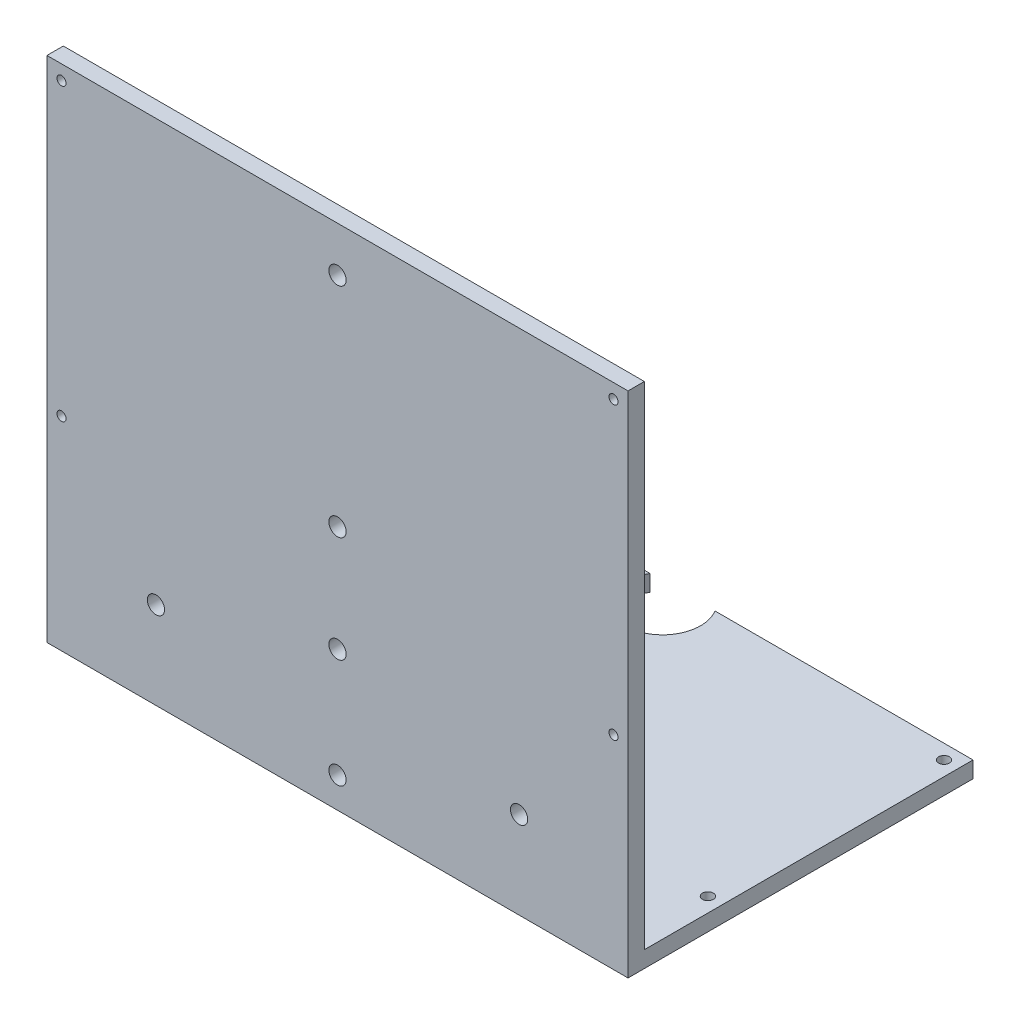
ISO-10303-21;
HEADER;
FILE_DESCRIPTION(('STEP AP214'),'2;1');
FILE_NAME('part.step','',(''),(''),'','','');
FILE_SCHEMA(('AUTOMOTIVE_DESIGN { 1 0 10303 214 1 1 1 1 }'));
ENDSEC;
DATA;
#1=APPLICATION_CONTEXT('core data for automotive mechanical design processes');
#2=APPLICATION_PROTOCOL_DEFINITION('international standard','automotive_design',2000,#1);
#3=PRODUCT_CONTEXT('',#1,'mechanical');
#4=PRODUCT('Part','Part','',(#3));
#5=PRODUCT_RELATED_PRODUCT_CATEGORY('part','',(#4));
#6=PRODUCT_DEFINITION_FORMATION('','',#4);
#7=PRODUCT_DEFINITION_CONTEXT('part definition',#1,'design');
#8=PRODUCT_DEFINITION('design','',#6,#7);
#9=PRODUCT_DEFINITION_SHAPE('','',#8);
#10=(LENGTH_UNIT() NAMED_UNIT(*) SI_UNIT(.MILLI.,.METRE.));
#11=(NAMED_UNIT(*) PLANE_ANGLE_UNIT() SI_UNIT($,.RADIAN.));
#12=(NAMED_UNIT(*) SI_UNIT($,.STERADIAN.) SOLID_ANGLE_UNIT());
#13=UNCERTAINTY_MEASURE_WITH_UNIT(LENGTH_MEASURE(1.E-05),#10,'distance_accuracy_value','');
#14=(GEOMETRIC_REPRESENTATION_CONTEXT(3) GLOBAL_UNCERTAINTY_ASSIGNED_CONTEXT((#13)) GLOBAL_UNIT_ASSIGNED_CONTEXT((#10,
#11,#12)) REPRESENTATION_CONTEXT('',''));
#15=CARTESIAN_POINT('',(0.,0.,0.));
#16=DIRECTION('',(0.,0.,1.));
#17=DIRECTION('',(1.,0.,0.));
#18=AXIS2_PLACEMENT_3D('',#15,#16,#17);
#19=CARTESIAN_POINT('',(-80.,4.5,-47.5));
#20=DIRECTION('',(0.,0.,1.));
#21=DIRECTION('',(1.,0.,0.));
#22=AXIS2_PLACEMENT_3D('',#19,#20,#21);
#23=PLANE('',#22);
#24=DIRECTION('',(-1.,0.,0.));
#25=VECTOR('',#24,1.);
#26=CARTESIAN_POINT('',(-80.,0.,-47.5));
#27=LINE('',#26,#25);
#28=CARTESIAN_POINT('',(80.,0.,-47.5));
#29=VERTEX_POINT('',#28);
#30=CARTESIAN_POINT('',(8.94427190999911,0.,-47.5));
#31=VERTEX_POINT('',#30);
#32=EDGE_CURVE('E114',#29,#31,#27,.T.);
#33=ORIENTED_EDGE('',*,*,#32,.T.);
#34=DIRECTION('',(0.,1.,0.));
#35=VECTOR('',#34,1.);
#36=CARTESIAN_POINT('',(8.94427190999911,-0.5,-47.5));
#37=LINE('',#36,#35);
#38=CARTESIAN_POINT('',(8.94427190999911,4.5,-47.5));
#39=VERTEX_POINT('',#38);
#40=EDGE_CURVE('E51',#31,#39,#37,.T.);
#41=ORIENTED_EDGE('',*,*,#40,.T.);
#42=DIRECTION('',(-1.,0.,0.));
#43=VECTOR('',#42,1.);
#44=CARTESIAN_POINT('',(-80.,4.5,-47.5));
#45=LINE('',#44,#43);
#46=CARTESIAN_POINT('',(80.,4.5,-47.5));
#47=VERTEX_POINT('',#46);
#48=EDGE_CURVE('E112',#47,#39,#45,.T.);
#49=ORIENTED_EDGE('',*,*,#48,.F.);
#50=DIRECTION('',(0.,-1.,0.));
#51=VECTOR('',#50,1.);
#52=CARTESIAN_POINT('',(80.,4.5,-47.5));
#53=LINE('',#52,#51);
#54=EDGE_CURVE('E45',#47,#29,#53,.T.);
#55=ORIENTED_EDGE('',*,*,#54,.T.);
#56=EDGE_LOOP('',(#33,#41,#49,#55));
#57=FACE_BOUND('',#56,.T.);
#58=ADVANCED_FACE('F37',(#57),#23,.F.);
#59=CARTESIAN_POINT('',(0.,4.5,0.));
#60=DIRECTION('',(0.,-1.,0.));
#61=DIRECTION('',(0.,0.,-1.));
#62=AXIS2_PLACEMENT_3D('',#59,#60,#61);
#63=PLANE('',#62);
#64=CARTESIAN_POINT('',(-45.9177062683101,4.5,-40.6059136497703));
#65=DIRECTION('',(0.,1.,0.));
#66=DIRECTION('',(0.,0.,1.));
#67=AXIS2_PLACEMENT_3D('',#64,#65,#66);
#68=CIRCLE('',#67,5.);
#69=CARTESIAN_POINT('',(-45.9177062683101,4.5,-35.6059136497703));
#70=VERTEX_POINT('',#69);
#71=EDGE_CURVE('E106',#70,#70,#68,.T.);
#72=ORIENTED_EDGE('',*,*,#71,.F.);
#73=EDGE_LOOP('',(#72));
#74=FACE_BOUND('',#73,.T.);
#75=CARTESIAN_POINT('',(-28.55,4.5,-43.75));
#76=DIRECTION('',(0.,1.,0.));
#77=DIRECTION('',(0.,0.,1.));
#78=AXIS2_PLACEMENT_3D('',#75,#76,#77);
#79=CIRCLE('',#78,1.4);
#80=CARTESIAN_POINT('',(-28.55,4.5,-42.35));
#81=VERTEX_POINT('',#80);
#82=EDGE_CURVE('E266',#81,#81,#79,.T.);
#83=ORIENTED_EDGE('',*,*,#82,.F.);
#84=EDGE_LOOP('',(#83));
#85=FACE_BOUND('',#84,.T.);
#86=CARTESIAN_POINT('',(-55.25,4.5,-30.17));
#87=DIRECTION('',(0.,1.,0.));
#88=DIRECTION('',(0.,0.,1.));
#89=AXIS2_PLACEMENT_3D('',#86,#87,#88);
#90=CIRCLE('',#89,1.4);
#91=CARTESIAN_POINT('',(-55.25,4.5,-28.77));
#92=VERTEX_POINT('',#91);
#93=EDGE_CURVE('E263',#92,#92,#90,.T.);
#94=ORIENTED_EDGE('',*,*,#93,.F.);
#95=EDGE_LOOP('',(#94));
#96=FACE_BOUND('',#95,.T.);
#97=CARTESIAN_POINT('',(76.,4.5,21.5));
#98=DIRECTION('',(0.,1.,0.));
#99=DIRECTION('',(0.,0.,1.));
#100=AXIS2_PLACEMENT_3D('',#97,#98,#99);
#101=CIRCLE('',#100,1.5);
#102=CARTESIAN_POINT('',(76.,4.5,23.));
#103=VERTEX_POINT('',#102);
#104=EDGE_CURVE('E158',#103,#103,#101,.T.);
#105=ORIENTED_EDGE('',*,*,#104,.F.);
#106=EDGE_LOOP('',(#105));
#107=FACE_BOUND('',#106,.T.);
#108=CARTESIAN_POINT('',(-75.9999999999998,4.5,21.5000000000011));
#109=DIRECTION('',(0.,1.,0.));
#110=DIRECTION('',(0.,0.,1.));
#111=AXIS2_PLACEMENT_3D('',#108,#109,#110);
#112=CIRCLE('',#111,1.5);
#113=CARTESIAN_POINT('',(-75.9999999999998,4.5,23.0000000000011));
#114=VERTEX_POINT('',#113);
#115=EDGE_CURVE('E155',#114,#114,#112,.T.);
#116=ORIENTED_EDGE('',*,*,#115,.F.);
#117=EDGE_LOOP('',(#116));
#118=FACE_BOUND('',#117,.T.);
#119=CARTESIAN_POINT('',(-76.,4.5,-43.4999999999989));
#120=DIRECTION('',(0.,1.,0.));
#121=DIRECTION('',(0.,0.,1.));
#122=AXIS2_PLACEMENT_3D('',#119,#120,#121);
#123=CIRCLE('',#122,1.5);
#124=CARTESIAN_POINT('',(-76.,4.5,-41.9999999999989));
#125=VERTEX_POINT('',#124);
#126=EDGE_CURVE('E151',#125,#125,#123,.T.);
#127=ORIENTED_EDGE('',*,*,#126,.F.);
#128=EDGE_LOOP('',(#127));
#129=FACE_BOUND('',#128,.T.);
#130=CARTESIAN_POINT('',(75.9999999999998,4.5,-43.5));
#131=DIRECTION('',(0.,1.,0.));
#132=DIRECTION('',(0.,0.,1.));
#133=AXIS2_PLACEMENT_3D('',#130,#131,#132);
#134=CIRCLE('',#133,1.5);
#135=CARTESIAN_POINT('',(75.9999999999998,4.5,-42.));
#136=VERTEX_POINT('',#135);
#137=EDGE_CURVE('E146',#136,#136,#134,.T.);
#138=ORIENTED_EDGE('',*,*,#137,.F.);
#139=EDGE_LOOP('',(#138));
#140=FACE_BOUND('',#139,.T.);
#141=ORIENTED_EDGE('',*,*,#48,.T.);
#142=CARTESIAN_POINT('',(0.,4.5,-42.));
#143=DIRECTION('',(0.,1.,0.));
#144=DIRECTION('',(0.,0.,1.));
#145=AXIS2_PLACEMENT_3D('',#142,#143,#144);
#146=CIRCLE('',#145,10.5);
#147=CARTESIAN_POINT('',(-8.94427190999916,4.5,-47.5));
#148=VERTEX_POINT('',#147);
#149=EDGE_CURVE('E99',#148,#39,#146,.T.);
#150=ORIENTED_EDGE('',*,*,#149,.F.);
#151=CARTESIAN_POINT('',(-80.,4.5,-47.5));
#152=VERTEX_POINT('',#151);
#153=EDGE_CURVE('E120',#148,#152,#45,.T.);
#154=ORIENTED_EDGE('',*,*,#153,.T.);
#155=DIRECTION('',(0.,0.,1.));
#156=VECTOR('',#155,1.);
#157=CARTESIAN_POINT('',(-80.,4.5,47.5));
#158=LINE('',#157,#156);
#159=CARTESIAN_POINT('',(-80.,4.5,43.));
#160=VERTEX_POINT('',#159);
#161=EDGE_CURVE('E119',#152,#160,#158,.T.);
#162=ORIENTED_EDGE('',*,*,#161,.T.);
#163=DIRECTION('',(-1.,0.,0.));
#164=VECTOR('',#163,1.);
#165=CARTESIAN_POINT('',(80.,4.5,43.));
#166=LINE('',#165,#164);
#167=CARTESIAN_POINT('',(80.,4.5,43.));
#168=VERTEX_POINT('',#167);
#169=EDGE_CURVE('E59',#168,#160,#166,.T.);
#170=ORIENTED_EDGE('',*,*,#169,.F.);
#171=DIRECTION('',(0.,0.,-1.));
#172=VECTOR('',#171,1.);
#173=CARTESIAN_POINT('',(80.,4.5,47.5));
#174=LINE('',#173,#172);
#175=EDGE_CURVE('E118',#168,#47,#174,.T.);
#176=ORIENTED_EDGE('',*,*,#175,.T.);
#177=EDGE_LOOP('',(#141,#150,#154,#162,#170,#176));
#178=FACE_BOUND('',#177,.T.);
#179=ADVANCED_FACE('F117',(#74,#85,#96,#107,#118,#129,#140,#178),#63,.F.);
#180=CARTESIAN_POINT('',(80.,4.5,47.5));
#181=DIRECTION('',(-1.,0.,0.));
#182=DIRECTION('',(0.,0.,1.));
#183=AXIS2_PLACEMENT_3D('',#180,#181,#182);
#184=PLANE('',#183);
#185=DIRECTION('',(0.,0.,-1.));
#186=VECTOR('',#185,1.);
#187=CARTESIAN_POINT('',(80.,0.,47.5));
#188=LINE('',#187,#186);
#189=CARTESIAN_POINT('',(80.,0.,47.5));
#190=VERTEX_POINT('',#189);
#191=EDGE_CURVE('E130',#190,#29,#188,.T.);
#192=ORIENTED_EDGE('',*,*,#191,.T.);
#193=ORIENTED_EDGE('',*,*,#54,.F.);
#194=ORIENTED_EDGE('',*,*,#175,.F.);
#195=DIRECTION('',(0.,-1.,0.));
#196=VECTOR('',#195,1.);
#197=CARTESIAN_POINT('',(80.,140.,43.));
#198=LINE('',#197,#196);
#199=CARTESIAN_POINT('',(80.,140.,43.));
#200=VERTEX_POINT('',#199);
#201=EDGE_CURVE('E150',#200,#168,#198,.T.);
#202=ORIENTED_EDGE('',*,*,#201,.F.);
#203=DIRECTION('',(0.,0.,-1.));
#204=VECTOR('',#203,1.);
#205=CARTESIAN_POINT('',(80.,140.,47.5));
#206=LINE('',#205,#204);
#207=CARTESIAN_POINT('',(80.,140.,47.5));
#208=VERTEX_POINT('',#207);
#209=EDGE_CURVE('E137',#208,#200,#206,.T.);
#210=ORIENTED_EDGE('',*,*,#209,.F.);
#211=DIRECTION('',(0.,-1.,0.));
#212=VECTOR('',#211,1.);
#213=CARTESIAN_POINT('',(80.,4.5,47.5));
#214=LINE('',#213,#212);
#215=EDGE_CURVE('E122',#208,#190,#214,.T.);
#216=ORIENTED_EDGE('',*,*,#215,.T.);
#217=EDGE_LOOP('',(#192,#193,#194,#202,#210,#216));
#218=FACE_BOUND('',#217,.T.);
#219=ADVANCED_FACE('F39',(#218),#184,.F.);
#220=ORIENTED_EDGE('',*,*,#153,.F.);
#221=DIRECTION('',(0.,1.,0.));
#222=VECTOR('',#221,1.);
#223=CARTESIAN_POINT('',(-8.94427190999916,-0.5,-47.5));
#224=LINE('',#223,#222);
#225=CARTESIAN_POINT('',(-8.94427190999916,0.,-47.5));
#226=VERTEX_POINT('',#225);
#227=EDGE_CURVE('E102',#148,#226,#224,.F.);
#228=ORIENTED_EDGE('',*,*,#227,.T.);
#229=CARTESIAN_POINT('',(-80.,0.,-47.5));
#230=VERTEX_POINT('',#229);
#231=EDGE_CURVE('E356',#226,#230,#27,.T.);
#232=ORIENTED_EDGE('',*,*,#231,.T.);
#233=DIRECTION('',(0.,-1.,0.));
#234=VECTOR('',#233,1.);
#235=CARTESIAN_POINT('',(-80.,4.5,-47.5));
#236=LINE('',#235,#234);
#237=EDGE_CURVE('E218',#152,#230,#236,.T.);
#238=ORIENTED_EDGE('',*,*,#237,.F.);
#239=EDGE_LOOP('',(#220,#228,#232,#238));
#240=FACE_BOUND('',#239,.T.);
#241=ADVANCED_FACE('F200',(#240),#23,.F.);
#242=CARTESIAN_POINT('',(-80.,4.5,47.5));
#243=DIRECTION('',(1.,0.,0.));
#244=DIRECTION('',(0.,0.,-1.));
#245=AXIS2_PLACEMENT_3D('',#242,#243,#244);
#246=PLANE('',#245);
#247=DIRECTION('',(0.,0.,1.));
#248=VECTOR('',#247,1.);
#249=CARTESIAN_POINT('',(-80.,0.,47.5));
#250=LINE('',#249,#248);
#251=CARTESIAN_POINT('',(-80.,0.,47.5));
#252=VERTEX_POINT('',#251);
#253=EDGE_CURVE('E351',#230,#252,#250,.T.);
#254=ORIENTED_EDGE('',*,*,#253,.T.);
#255=DIRECTION('',(0.,-1.,0.));
#256=VECTOR('',#255,1.);
#257=CARTESIAN_POINT('',(-80.,4.5,47.5));
#258=LINE('',#257,#256);
#259=CARTESIAN_POINT('',(-80.,140.,47.5));
#260=VERTEX_POINT('',#259);
#261=EDGE_CURVE('E348',#260,#252,#258,.T.);
#262=ORIENTED_EDGE('',*,*,#261,.F.);
#263=DIRECTION('',(0.,0.,1.));
#264=VECTOR('',#263,1.);
#265=CARTESIAN_POINT('',(-80.,140.,47.5));
#266=LINE('',#265,#264);
#267=CARTESIAN_POINT('',(-80.,140.,43.));
#268=VERTEX_POINT('',#267);
#269=EDGE_CURVE('E228',#268,#260,#266,.T.);
#270=ORIENTED_EDGE('',*,*,#269,.F.);
#271=DIRECTION('',(0.,-1.,0.));
#272=VECTOR('',#271,1.);
#273=CARTESIAN_POINT('',(-80.,140.,43.));
#274=LINE('',#273,#272);
#275=EDGE_CURVE('E139',#268,#160,#274,.T.);
#276=ORIENTED_EDGE('',*,*,#275,.T.);
#277=ORIENTED_EDGE('',*,*,#161,.F.);
#278=ORIENTED_EDGE('',*,*,#237,.T.);
#279=EDGE_LOOP('',(#254,#262,#270,#276,#277,#278));
#280=FACE_BOUND('',#279,.T.);
#281=ADVANCED_FACE('F207',(#280),#246,.F.);
#282=CARTESIAN_POINT('',(-80.,4.5,47.5));
#283=DIRECTION('',(0.,0.,-1.));
#284=DIRECTION('',(-1.,0.,0.));
#285=AXIS2_PLACEMENT_3D('',#282,#283,#284);
#286=PLANE('',#285);
#287=CARTESIAN_POINT('',(0.,8.4,47.5));
#288=DIRECTION('',(0.,0.,-1.));
#289=DIRECTION('',(-1.,0.,0.));
#290=AXIS2_PLACEMENT_3D('',#287,#288,#289);
#291=CIRCLE('',#290,2.375);
#292=CARTESIAN_POINT('',(-2.37499999999997,8.4,47.5));
#293=VERTEX_POINT('',#292);
#294=EDGE_CURVE('E267',#293,#293,#291,.T.);
#295=ORIENTED_EDGE('',*,*,#294,.T.);
#296=EDGE_LOOP('',(#295));
#297=FACE_BOUND('',#296,.T.);
#298=CARTESIAN_POINT('',(50.0000000000001,24.,47.5));
#299=DIRECTION('',(0.,0.,-1.));
#300=DIRECTION('',(-1.,0.,0.));
#301=AXIS2_PLACEMENT_3D('',#298,#299,#300);
#302=CIRCLE('',#301,2.375);
#303=CARTESIAN_POINT('',(47.6250000000001,24.,47.5));
#304=VERTEX_POINT('',#303);
#305=EDGE_CURVE('E274',#304,#304,#302,.T.);
#306=ORIENTED_EDGE('',*,*,#305,.T.);
#307=EDGE_LOOP('',(#306));
#308=FACE_BOUND('',#307,.T.);
#309=CARTESIAN_POINT('',(0.,127.6,47.5));
#310=DIRECTION('',(0.,0.,-1.));
#311=DIRECTION('',(-1.,0.,0.));
#312=AXIS2_PLACEMENT_3D('',#309,#310,#311);
#313=CIRCLE('',#312,2.375);
#314=CARTESIAN_POINT('',(-2.37500000000004,127.6,47.5));
#315=VERTEX_POINT('',#314);
#316=EDGE_CURVE('E277',#315,#315,#313,.T.);
#317=ORIENTED_EDGE('',*,*,#316,.T.);
#318=EDGE_LOOP('',(#317));
#319=FACE_BOUND('',#318,.T.);
#320=CARTESIAN_POINT('',(0.,67.6,47.5));
#321=DIRECTION('',(0.,0.,-1.));
#322=DIRECTION('',(-1.,0.,0.));
#323=AXIS2_PLACEMENT_3D('',#320,#321,#322);
#324=CIRCLE('',#323,2.375);
#325=CARTESIAN_POINT('',(-2.37500000000004,67.6,47.5));
#326=VERTEX_POINT('',#325);
#327=EDGE_CURVE('E280',#326,#326,#324,.T.);
#328=ORIENTED_EDGE('',*,*,#327,.T.);
#329=EDGE_LOOP('',(#328));
#330=FACE_BOUND('',#329,.T.);
#331=CARTESIAN_POINT('',(0.,38.4,47.5));
#332=DIRECTION('',(0.,0.,-1.));
#333=DIRECTION('',(-1.,0.,0.));
#334=AXIS2_PLACEMENT_3D('',#331,#332,#333);
#335=CIRCLE('',#334,2.375);
#336=CARTESIAN_POINT('',(-2.37499999999997,38.4,47.5));
#337=VERTEX_POINT('',#336);
#338=EDGE_CURVE('E283',#337,#337,#335,.T.);
#339=ORIENTED_EDGE('',*,*,#338,.T.);
#340=EDGE_LOOP('',(#339));
#341=FACE_BOUND('',#340,.T.);
#342=CARTESIAN_POINT('',(-50.,24.,47.5));
#343=DIRECTION('',(0.,0.,-1.));
#344=DIRECTION('',(-1.,0.,0.));
#345=AXIS2_PLACEMENT_3D('',#342,#343,#344);
#346=CIRCLE('',#345,2.37500000000002);
#347=CARTESIAN_POINT('',(-52.375,24.,47.5));
#348=VERTEX_POINT('',#347);
#349=EDGE_CURVE('E286',#348,#348,#346,.T.);
#350=ORIENTED_EDGE('',*,*,#349,.T.);
#351=EDGE_LOOP('',(#350));
#352=FACE_BOUND('',#351,.T.);
#353=CARTESIAN_POINT('',(-76.0000000000008,56.,47.5));
#354=DIRECTION('',(0.,0.,-1.));
#355=DIRECTION('',(-1.,0.,0.));
#356=AXIS2_PLACEMENT_3D('',#353,#354,#355);
#357=CIRCLE('',#356,1.25);
#358=CARTESIAN_POINT('',(-77.2500000000008,56.,47.5));
#359=VERTEX_POINT('',#358);
#360=EDGE_CURVE('E138',#359,#359,#357,.T.);
#361=ORIENTED_EDGE('',*,*,#360,.T.);
#362=EDGE_LOOP('',(#361));
#363=FACE_BOUND('',#362,.T.);
#364=CARTESIAN_POINT('',(75.9999999999992,55.999999999999,47.5));
#365=DIRECTION('',(0.,0.,-1.));
#366=DIRECTION('',(-1.,0.,0.));
#367=AXIS2_PLACEMENT_3D('',#364,#365,#366);
#368=CIRCLE('',#367,1.25);
#369=CARTESIAN_POINT('',(74.7499999999992,55.999999999999,47.5));
#370=VERTEX_POINT('',#369);
#371=EDGE_CURVE('E241',#370,#370,#368,.T.);
#372=ORIENTED_EDGE('',*,*,#371,.T.);
#373=EDGE_LOOP('',(#372));
#374=FACE_BOUND('',#373,.T.);
#375=CARTESIAN_POINT('',(76.,135.999999999999,47.5));
#376=DIRECTION('',(0.,0.,-1.));
#377=DIRECTION('',(-1.,0.,0.));
#378=AXIS2_PLACEMENT_3D('',#375,#376,#377);
#379=CIRCLE('',#378,1.25);
#380=CARTESIAN_POINT('',(74.75,135.999999999999,47.5));
#381=VERTEX_POINT('',#380);
#382=EDGE_CURVE('E244',#381,#381,#379,.T.);
#383=ORIENTED_EDGE('',*,*,#382,.T.);
#384=EDGE_LOOP('',(#383));
#385=FACE_BOUND('',#384,.T.);
#386=CARTESIAN_POINT('',(-76.,136.,47.5));
#387=DIRECTION('',(0.,0.,-1.));
#388=DIRECTION('',(-1.,0.,0.));
#389=AXIS2_PLACEMENT_3D('',#386,#387,#388);
#390=CIRCLE('',#389,1.25);
#391=CARTESIAN_POINT('',(-77.25,136.,47.5));
#392=VERTEX_POINT('',#391);
#393=EDGE_CURVE('E247',#392,#392,#390,.T.);
#394=ORIENTED_EDGE('',*,*,#393,.T.);
#395=EDGE_LOOP('',(#394));
#396=FACE_BOUND('',#395,.T.);
#397=DIRECTION('',(1.,0.,0.));
#398=VECTOR('',#397,1.);
#399=CARTESIAN_POINT('',(-80.,0.,47.5));
#400=LINE('',#399,#398);
#401=EDGE_CURVE('E346',#252,#190,#400,.T.);
#402=ORIENTED_EDGE('',*,*,#401,.T.);
#403=ORIENTED_EDGE('',*,*,#215,.F.);
#404=DIRECTION('',(1.,0.,0.));
#405=VECTOR('',#404,1.);
#406=CARTESIAN_POINT('',(80.,140.,47.5));
#407=LINE('',#406,#405);
#408=EDGE_CURVE('E144',#260,#208,#407,.T.);
#409=ORIENTED_EDGE('',*,*,#408,.F.);
#410=ORIENTED_EDGE('',*,*,#261,.T.);
#411=EDGE_LOOP('',(#402,#403,#409,#410));
#412=FACE_BOUND('',#411,.T.);
#413=ADVANCED_FACE('F182',(#297,#308,#319,#330,#341,#352,#363,#374,#385,#396,#412),#286,.F.);
#414=CARTESIAN_POINT('',(0.,0.,0.));
#415=DIRECTION('',(0.,-1.,0.));
#416=DIRECTION('',(0.,0.,-1.));
#417=AXIS2_PLACEMENT_3D('',#414,#415,#416);
#418=PLANE('',#417);
#419=CARTESIAN_POINT('',(0.,0.,-42.));
#420=DIRECTION('',(0.,-1.,0.));
#421=DIRECTION('',(0.,0.,-1.));
#422=AXIS2_PLACEMENT_3D('',#419,#420,#421);
#423=CIRCLE('',#422,10.5);
#424=EDGE_CURVE('E11',#31,#226,#423,.T.);
#425=ORIENTED_EDGE('',*,*,#424,.F.);
#426=ORIENTED_EDGE('',*,*,#32,.F.);
#427=ORIENTED_EDGE('',*,*,#191,.F.);
#428=ORIENTED_EDGE('',*,*,#401,.F.);
#429=ORIENTED_EDGE('',*,*,#253,.F.);
#430=ORIENTED_EDGE('',*,*,#231,.F.);
#431=EDGE_LOOP('',(#425,#426,#427,#428,#429,#430));
#432=FACE_BOUND('',#431,.T.);
#433=CARTESIAN_POINT('',(-45.9177062683101,0.,-40.6059136497703));
#434=DIRECTION('',(0.,-1.,0.));
#435=DIRECTION('',(0.,0.,-1.));
#436=AXIS2_PLACEMENT_3D('',#433,#434,#435);
#437=CIRCLE('',#436,5.);
#438=CARTESIAN_POINT('',(-45.9177062683101,0.,-45.6059136497703));
#439=VERTEX_POINT('',#438);
#440=EDGE_CURVE('E262',#439,#439,#437,.T.);
#441=ORIENTED_EDGE('',*,*,#440,.F.);
#442=EDGE_LOOP('',(#441));
#443=FACE_BOUND('',#442,.T.);
#444=CARTESIAN_POINT('',(-28.55,0.,-43.75));
#445=DIRECTION('',(0.,-1.,0.));
#446=DIRECTION('',(0.,0.,-1.));
#447=AXIS2_PLACEMENT_3D('',#444,#445,#446);
#448=CIRCLE('',#447,1.4);
#449=CARTESIAN_POINT('',(-28.55,0.,-45.15));
#450=VERTEX_POINT('',#449);
#451=EDGE_CURVE('E366',#450,#450,#448,.T.);
#452=ORIENTED_EDGE('',*,*,#451,.F.);
#453=EDGE_LOOP('',(#452));
#454=FACE_BOUND('',#453,.T.);
#455=CARTESIAN_POINT('',(-55.25,0.,-30.17));
#456=DIRECTION('',(0.,-1.,0.));
#457=DIRECTION('',(0.,0.,-1.));
#458=AXIS2_PLACEMENT_3D('',#455,#456,#457);
#459=CIRCLE('',#458,1.4);
#460=CARTESIAN_POINT('',(-55.25,0.,-31.57));
#461=VERTEX_POINT('',#460);
#462=EDGE_CURVE('E105',#461,#461,#459,.T.);
#463=ORIENTED_EDGE('',*,*,#462,.F.);
#464=EDGE_LOOP('',(#463));
#465=FACE_BOUND('',#464,.T.);
#466=CARTESIAN_POINT('',(75.9999999999998,0.,-43.5));
#467=DIRECTION('',(0.,-1.,0.));
#468=DIRECTION('',(0.,0.,-1.));
#469=AXIS2_PLACEMENT_3D('',#466,#467,#468);
#470=CIRCLE('',#469,1.5);
#471=CARTESIAN_POINT('',(75.9999999999998,0.,-45.));
#472=VERTEX_POINT('',#471);
#473=EDGE_CURVE('E149',#472,#472,#470,.T.);
#474=ORIENTED_EDGE('',*,*,#473,.F.);
#475=EDGE_LOOP('',(#474));
#476=FACE_BOUND('',#475,.T.);
#477=CARTESIAN_POINT('',(-76.,0.,-43.4999999999989));
#478=DIRECTION('',(0.,-1.,0.));
#479=DIRECTION('',(0.,0.,-1.));
#480=AXIS2_PLACEMENT_3D('',#477,#478,#479);
#481=CIRCLE('',#480,1.5);
#482=CARTESIAN_POINT('',(-76.,0.,-44.9999999999989));
#483=VERTEX_POINT('',#482);
#484=EDGE_CURVE('E154',#483,#483,#481,.T.);
#485=ORIENTED_EDGE('',*,*,#484,.F.);
#486=EDGE_LOOP('',(#485));
#487=FACE_BOUND('',#486,.T.);
#488=CARTESIAN_POINT('',(-75.9999999999998,0.,21.5000000000011));
#489=DIRECTION('',(0.,-1.,0.));
#490=DIRECTION('',(0.,0.,-1.));
#491=AXIS2_PLACEMENT_3D('',#488,#489,#490);
#492=CIRCLE('',#491,1.5);
#493=CARTESIAN_POINT('',(-75.9999999999998,0.,20.0000000000011));
#494=VERTEX_POINT('',#493);
#495=EDGE_CURVE('E157',#494,#494,#492,.T.);
#496=ORIENTED_EDGE('',*,*,#495,.F.);
#497=EDGE_LOOP('',(#496));
#498=FACE_BOUND('',#497,.T.);
#499=CARTESIAN_POINT('',(76.,0.,21.5));
#500=DIRECTION('',(0.,-1.,0.));
#501=DIRECTION('',(0.,0.,-1.));
#502=AXIS2_PLACEMENT_3D('',#499,#500,#501);
#503=CIRCLE('',#502,1.5);
#504=CARTESIAN_POINT('',(76.,0.,20.));
#505=VERTEX_POINT('',#504);
#506=EDGE_CURVE('E160',#505,#505,#503,.T.);
#507=ORIENTED_EDGE('',*,*,#506,.F.);
#508=EDGE_LOOP('',(#507));
#509=FACE_BOUND('',#508,.T.);
#510=ADVANCED_FACE('F178',(#432,#443,#454,#465,#476,#487,#498,#509),#418,.T.);
#511=CARTESIAN_POINT('',(76.,-0.5,21.5));
#512=DIRECTION('',(0.,1.,0.));
#513=DIRECTION('',(0.,0.,1.));
#514=AXIS2_PLACEMENT_3D('',#511,#512,#513);
#515=CYLINDRICAL_SURFACE('',#514,1.5);
#516=ORIENTED_EDGE('',*,*,#506,.T.);
#517=EDGE_LOOP('',(#516));
#518=FACE_BOUND('',#517,.T.);
#519=ORIENTED_EDGE('',*,*,#104,.T.);
#520=EDGE_LOOP('',(#519));
#521=FACE_BOUND('',#520,.T.);
#522=ADVANCED_FACE('F181',(#518,#521),#515,.F.);
#523=CARTESIAN_POINT('',(-75.9999999999998,-0.5,21.5000000000011));
#524=DIRECTION('',(0.,1.,0.));
#525=DIRECTION('',(0.,0.,1.));
#526=AXIS2_PLACEMENT_3D('',#523,#524,#525);
#527=CYLINDRICAL_SURFACE('',#526,1.5);
#528=ORIENTED_EDGE('',*,*,#495,.T.);
#529=EDGE_LOOP('',(#528));
#530=FACE_BOUND('',#529,.T.);
#531=ORIENTED_EDGE('',*,*,#115,.T.);
#532=EDGE_LOOP('',(#531));
#533=FACE_BOUND('',#532,.T.);
#534=ADVANCED_FACE('F191',(#530,#533),#527,.F.);
#535=CARTESIAN_POINT('',(-76.,-0.5,-43.4999999999989));
#536=DIRECTION('',(0.,1.,0.));
#537=DIRECTION('',(0.,0.,1.));
#538=AXIS2_PLACEMENT_3D('',#535,#536,#537);
#539=CYLINDRICAL_SURFACE('',#538,1.5);
#540=ORIENTED_EDGE('',*,*,#484,.T.);
#541=EDGE_LOOP('',(#540));
#542=FACE_BOUND('',#541,.T.);
#543=ORIENTED_EDGE('',*,*,#126,.T.);
#544=EDGE_LOOP('',(#543));
#545=FACE_BOUND('',#544,.T.);
#546=ADVANCED_FACE('F196',(#542,#545),#539,.F.);
#547=CARTESIAN_POINT('',(75.9999999999998,-0.5,-43.5));
#548=DIRECTION('',(0.,1.,0.));
#549=DIRECTION('',(0.,0.,1.));
#550=AXIS2_PLACEMENT_3D('',#547,#548,#549);
#551=CYLINDRICAL_SURFACE('',#550,1.5);
#552=ORIENTED_EDGE('',*,*,#473,.T.);
#553=EDGE_LOOP('',(#552));
#554=FACE_BOUND('',#553,.T.);
#555=ORIENTED_EDGE('',*,*,#137,.T.);
#556=EDGE_LOOP('',(#555));
#557=FACE_BOUND('',#556,.T.);
#558=ADVANCED_FACE('F175',(#554,#557),#551,.F.);
#559=CARTESIAN_POINT('',(80.,140.,43.));
#560=DIRECTION('',(0.,0.,1.));
#561=DIRECTION('',(1.,0.,0.));
#562=AXIS2_PLACEMENT_3D('',#559,#560,#561);
#563=PLANE('',#562);
#564=CARTESIAN_POINT('',(0.,8.4,43.));
#565=DIRECTION('',(0.,0.,-1.));
#566=DIRECTION('',(-1.,0.,0.));
#567=AXIS2_PLACEMENT_3D('',#564,#565,#566);
#568=CIRCLE('',#567,2.375);
#569=CARTESIAN_POINT('',(-2.37499999999997,8.4,43.));
#570=VERTEX_POINT('',#569);
#571=EDGE_CURVE('E289',#570,#570,#568,.T.);
#572=ORIENTED_EDGE('',*,*,#571,.F.);
#573=EDGE_LOOP('',(#572));
#574=FACE_BOUND('',#573,.T.);
#575=CARTESIAN_POINT('',(50.0000000000001,24.,43.));
#576=DIRECTION('',(0.,0.,-1.));
#577=DIRECTION('',(-1.,0.,0.));
#578=AXIS2_PLACEMENT_3D('',#575,#576,#577);
#579=CIRCLE('',#578,2.375);
#580=CARTESIAN_POINT('',(47.6250000000001,24.,43.));
#581=VERTEX_POINT('',#580);
#582=EDGE_CURVE('E293',#581,#581,#579,.T.);
#583=ORIENTED_EDGE('',*,*,#582,.F.);
#584=EDGE_LOOP('',(#583));
#585=FACE_BOUND('',#584,.T.);
#586=CARTESIAN_POINT('',(0.,127.6,43.));
#587=DIRECTION('',(0.,0.,-1.));
#588=DIRECTION('',(-1.,0.,0.));
#589=AXIS2_PLACEMENT_3D('',#586,#587,#588);
#590=CIRCLE('',#589,2.375);
#591=CARTESIAN_POINT('',(-2.37500000000004,127.6,43.));
#592=VERTEX_POINT('',#591);
#593=EDGE_CURVE('E298',#592,#592,#590,.T.);
#594=ORIENTED_EDGE('',*,*,#593,.F.);
#595=EDGE_LOOP('',(#594));
#596=FACE_BOUND('',#595,.T.);
#597=CARTESIAN_POINT('',(0.,67.6,43.));
#598=DIRECTION('',(0.,0.,-1.));
#599=DIRECTION('',(-1.,0.,0.));
#600=AXIS2_PLACEMENT_3D('',#597,#598,#599);
#601=CIRCLE('',#600,2.375);
#602=CARTESIAN_POINT('',(-2.37500000000004,67.6,43.));
#603=VERTEX_POINT('',#602);
#604=EDGE_CURVE('E294',#603,#603,#601,.T.);
#605=ORIENTED_EDGE('',*,*,#604,.F.);
#606=EDGE_LOOP('',(#605));
#607=FACE_BOUND('',#606,.T.);
#608=CARTESIAN_POINT('',(0.,38.4,43.));
#609=DIRECTION('',(0.,0.,-1.));
#610=DIRECTION('',(-1.,0.,0.));
#611=AXIS2_PLACEMENT_3D('',#608,#609,#610);
#612=CIRCLE('',#611,2.375);
#613=CARTESIAN_POINT('',(-2.37499999999997,38.4,43.));
#614=VERTEX_POINT('',#613);
#615=EDGE_CURVE('E297',#614,#614,#612,.T.);
#616=ORIENTED_EDGE('',*,*,#615,.F.);
#617=EDGE_LOOP('',(#616));
#618=FACE_BOUND('',#617,.T.);
#619=CARTESIAN_POINT('',(-50.,24.,43.));
#620=DIRECTION('',(0.,0.,-1.));
#621=DIRECTION('',(-1.,0.,0.));
#622=AXIS2_PLACEMENT_3D('',#619,#620,#621);
#623=CIRCLE('',#622,2.37500000000002);
#624=CARTESIAN_POINT('',(-52.375,24.,43.));
#625=VERTEX_POINT('',#624);
#626=EDGE_CURVE('E290',#625,#625,#623,.T.);
#627=ORIENTED_EDGE('',*,*,#626,.F.);
#628=EDGE_LOOP('',(#627));
#629=FACE_BOUND('',#628,.T.);
#630=CARTESIAN_POINT('',(-76.0000000000008,56.,43.));
#631=DIRECTION('',(0.,0.,-1.));
#632=DIRECTION('',(-1.,0.,0.));
#633=AXIS2_PLACEMENT_3D('',#630,#631,#632);
#634=CIRCLE('',#633,1.25);
#635=CARTESIAN_POINT('',(-77.2500000000008,56.,43.));
#636=VERTEX_POINT('',#635);
#637=EDGE_CURVE('E115',#636,#636,#634,.T.);
#638=ORIENTED_EDGE('',*,*,#637,.F.);
#639=EDGE_LOOP('',(#638));
#640=FACE_BOUND('',#639,.T.);
#641=CARTESIAN_POINT('',(75.9999999999992,55.999999999999,43.));
#642=DIRECTION('',(0.,0.,-1.));
#643=DIRECTION('',(-1.,0.,0.));
#644=AXIS2_PLACEMENT_3D('',#641,#642,#643);
#645=CIRCLE('',#644,1.25);
#646=CARTESIAN_POINT('',(74.7499999999992,55.999999999999,43.));
#647=VERTEX_POINT('',#646);
#648=EDGE_CURVE('E256',#647,#647,#645,.T.);
#649=ORIENTED_EDGE('',*,*,#648,.F.);
#650=EDGE_LOOP('',(#649));
#651=FACE_BOUND('',#650,.T.);
#652=CARTESIAN_POINT('',(76.,135.999999999999,43.));
#653=DIRECTION('',(0.,0.,-1.));
#654=DIRECTION('',(-1.,0.,0.));
#655=AXIS2_PLACEMENT_3D('',#652,#653,#654);
#656=CIRCLE('',#655,1.25);
#657=CARTESIAN_POINT('',(74.75,135.999999999999,43.));
#658=VERTEX_POINT('',#657);
#659=EDGE_CURVE('E253',#658,#658,#656,.T.);
#660=ORIENTED_EDGE('',*,*,#659,.F.);
#661=EDGE_LOOP('',(#660));
#662=FACE_BOUND('',#661,.T.);
#663=CARTESIAN_POINT('',(-76.,136.,43.));
#664=DIRECTION('',(0.,0.,-1.));
#665=DIRECTION('',(-1.,0.,0.));
#666=AXIS2_PLACEMENT_3D('',#663,#664,#665);
#667=CIRCLE('',#666,1.25);
#668=CARTESIAN_POINT('',(-77.25,136.,43.));
#669=VERTEX_POINT('',#668);
#670=EDGE_CURVE('E250',#669,#669,#667,.T.);
#671=ORIENTED_EDGE('',*,*,#670,.F.);
#672=EDGE_LOOP('',(#671));
#673=FACE_BOUND('',#672,.T.);
#674=ORIENTED_EDGE('',*,*,#169,.T.);
#675=ORIENTED_EDGE('',*,*,#275,.F.);
#676=DIRECTION('',(-1.,0.,0.));
#677=VECTOR('',#676,1.);
#678=CARTESIAN_POINT('',(80.,140.,43.));
#679=LINE('',#678,#677);
#680=EDGE_CURVE('E235',#200,#268,#679,.T.);
#681=ORIENTED_EDGE('',*,*,#680,.F.);
#682=ORIENTED_EDGE('',*,*,#201,.T.);
#683=EDGE_LOOP('',(#674,#675,#681,#682));
#684=FACE_BOUND('',#683,.T.);
#685=ADVANCED_FACE('F224',(#574,#585,#596,#607,#618,#629,#640,#651,#662,#673,#684),#563,.F.);
#686=CARTESIAN_POINT('',(0.,140.,0.));
#687=DIRECTION('',(0.,1.,0.));
#688=DIRECTION('',(0.,0.,1.));
#689=AXIS2_PLACEMENT_3D('',#686,#687,#688);
#690=PLANE('',#689);
#691=ORIENTED_EDGE('',*,*,#209,.T.);
#692=ORIENTED_EDGE('',*,*,#680,.T.);
#693=ORIENTED_EDGE('',*,*,#269,.T.);
#694=ORIENTED_EDGE('',*,*,#408,.T.);
#695=EDGE_LOOP('',(#691,#692,#693,#694));
#696=FACE_BOUND('',#695,.T.);
#697=ADVANCED_FACE('F313',(#696),#690,.T.);
#698=CARTESIAN_POINT('',(-76.,136.,48.));
#699=DIRECTION('',(0.,0.,-1.));
#700=DIRECTION('',(-1.,0.,0.));
#701=AXIS2_PLACEMENT_3D('',#698,#699,#700);
#702=CYLINDRICAL_SURFACE('',#701,1.25);
#703=ORIENTED_EDGE('',*,*,#670,.T.);
#704=EDGE_LOOP('',(#703));
#705=FACE_BOUND('',#704,.T.);
#706=ORIENTED_EDGE('',*,*,#393,.F.);
#707=EDGE_LOOP('',(#706));
#708=FACE_BOUND('',#707,.T.);
#709=ADVANCED_FACE('F333',(#705,#708),#702,.F.);
#710=CARTESIAN_POINT('',(76.,135.999999999999,48.));
#711=DIRECTION('',(0.,0.,-1.));
#712=DIRECTION('',(-1.,0.,0.));
#713=AXIS2_PLACEMENT_3D('',#710,#711,#712);
#714=CYLINDRICAL_SURFACE('',#713,1.25);
#715=ORIENTED_EDGE('',*,*,#659,.T.);
#716=EDGE_LOOP('',(#715));
#717=FACE_BOUND('',#716,.T.);
#718=ORIENTED_EDGE('',*,*,#382,.F.);
#719=EDGE_LOOP('',(#718));
#720=FACE_BOUND('',#719,.T.);
#721=ADVANCED_FACE('F336',(#717,#720),#714,.F.);
#722=CARTESIAN_POINT('',(75.9999999999992,55.999999999999,48.));
#723=DIRECTION('',(0.,0.,-1.));
#724=DIRECTION('',(-1.,0.,0.));
#725=AXIS2_PLACEMENT_3D('',#722,#723,#724);
#726=CYLINDRICAL_SURFACE('',#725,1.25);
#727=ORIENTED_EDGE('',*,*,#648,.T.);
#728=EDGE_LOOP('',(#727));
#729=FACE_BOUND('',#728,.T.);
#730=ORIENTED_EDGE('',*,*,#371,.F.);
#731=EDGE_LOOP('',(#730));
#732=FACE_BOUND('',#731,.T.);
#733=ADVANCED_FACE('F406',(#729,#732),#726,.F.);
#734=CARTESIAN_POINT('',(-76.0000000000008,56.,48.));
#735=DIRECTION('',(0.,0.,-1.));
#736=DIRECTION('',(-1.,0.,0.));
#737=AXIS2_PLACEMENT_3D('',#734,#735,#736);
#738=CYLINDRICAL_SURFACE('',#737,1.25);
#739=ORIENTED_EDGE('',*,*,#637,.T.);
#740=EDGE_LOOP('',(#739));
#741=FACE_BOUND('',#740,.T.);
#742=ORIENTED_EDGE('',*,*,#360,.F.);
#743=EDGE_LOOP('',(#742));
#744=FACE_BOUND('',#743,.T.);
#745=ADVANCED_FACE('F402',(#741,#744),#738,.F.);
#746=CARTESIAN_POINT('',(-55.25,-0.5,-30.17));
#747=DIRECTION('',(0.,1.,0.));
#748=DIRECTION('',(0.,0.,1.));
#749=AXIS2_PLACEMENT_3D('',#746,#747,#748);
#750=CYLINDRICAL_SURFACE('',#749,1.4);
#751=ORIENTED_EDGE('',*,*,#462,.T.);
#752=EDGE_LOOP('',(#751));
#753=FACE_BOUND('',#752,.T.);
#754=ORIENTED_EDGE('',*,*,#93,.T.);
#755=EDGE_LOOP('',(#754));
#756=FACE_BOUND('',#755,.T.);
#757=ADVANCED_FACE('F405',(#753,#756),#750,.F.);
#758=CARTESIAN_POINT('',(-28.55,-0.5,-43.75));
#759=DIRECTION('',(0.,1.,0.));
#760=DIRECTION('',(0.,0.,1.));
#761=AXIS2_PLACEMENT_3D('',#758,#759,#760);
#762=CYLINDRICAL_SURFACE('',#761,1.4);
#763=ORIENTED_EDGE('',*,*,#451,.T.);
#764=EDGE_LOOP('',(#763));
#765=FACE_BOUND('',#764,.T.);
#766=ORIENTED_EDGE('',*,*,#82,.T.);
#767=EDGE_LOOP('',(#766));
#768=FACE_BOUND('',#767,.T.);
#769=ADVANCED_FACE('F378',(#765,#768),#762,.F.);
#770=CARTESIAN_POINT('',(-45.9177062683101,-0.5,-40.6059136497703));
#771=DIRECTION('',(0.,1.,0.));
#772=DIRECTION('',(0.,0.,1.));
#773=AXIS2_PLACEMENT_3D('',#770,#771,#772);
#774=CYLINDRICAL_SURFACE('',#773,5.);
#775=ORIENTED_EDGE('',*,*,#440,.T.);
#776=EDGE_LOOP('',(#775));
#777=FACE_BOUND('',#776,.T.);
#778=ORIENTED_EDGE('',*,*,#71,.T.);
#779=EDGE_LOOP('',(#778));
#780=FACE_BOUND('',#779,.T.);
#781=ADVANCED_FACE('F375',(#777,#780),#774,.F.);
#782=CARTESIAN_POINT('',(0.,-0.5,-42.));
#783=DIRECTION('',(0.,1.,0.));
#784=DIRECTION('',(0.,0.,1.));
#785=AXIS2_PLACEMENT_3D('',#782,#783,#784);
#786=CYLINDRICAL_SURFACE('',#785,10.5);
#787=ORIENTED_EDGE('',*,*,#424,.T.);
#788=ORIENTED_EDGE('',*,*,#227,.F.);
#789=ORIENTED_EDGE('',*,*,#149,.T.);
#790=ORIENTED_EDGE('',*,*,#40,.F.);
#791=EDGE_LOOP('',(#787,#788,#789,#790));
#792=FACE_BOUND('',#791,.T.);
#793=ADVANCED_FACE('F100',(#792),#786,.F.);
#794=CARTESIAN_POINT('',(-50.,24.,53.));
#795=DIRECTION('',(0.,0.,-1.));
#796=DIRECTION('',(-1.,0.,0.));
#797=AXIS2_PLACEMENT_3D('',#794,#795,#796);
#798=CYLINDRICAL_SURFACE('',#797,2.37500000000002);
#799=ORIENTED_EDGE('',*,*,#626,.T.);
#800=EDGE_LOOP('',(#799));
#801=FACE_BOUND('',#800,.T.);
#802=ORIENTED_EDGE('',*,*,#349,.F.);
#803=EDGE_LOOP('',(#802));
#804=FACE_BOUND('',#803,.T.);
#805=ADVANCED_FACE('F421',(#801,#804),#798,.F.);
#806=CARTESIAN_POINT('',(0.,38.4,53.));
#807=DIRECTION('',(0.,0.,-1.));
#808=DIRECTION('',(-1.,0.,0.));
#809=AXIS2_PLACEMENT_3D('',#806,#807,#808);
#810=CYLINDRICAL_SURFACE('',#809,2.375);
#811=ORIENTED_EDGE('',*,*,#615,.T.);
#812=EDGE_LOOP('',(#811));
#813=FACE_BOUND('',#812,.T.);
#814=ORIENTED_EDGE('',*,*,#338,.F.);
#815=EDGE_LOOP('',(#814));
#816=FACE_BOUND('',#815,.T.);
#817=ADVANCED_FACE('F424',(#813,#816),#810,.F.);
#818=CARTESIAN_POINT('',(0.,67.6,53.));
#819=DIRECTION('',(0.,0.,-1.));
#820=DIRECTION('',(-1.,0.,0.));
#821=AXIS2_PLACEMENT_3D('',#818,#819,#820);
#822=CYLINDRICAL_SURFACE('',#821,2.375);
#823=ORIENTED_EDGE('',*,*,#604,.T.);
#824=EDGE_LOOP('',(#823));
#825=FACE_BOUND('',#824,.T.);
#826=ORIENTED_EDGE('',*,*,#327,.F.);
#827=EDGE_LOOP('',(#826));
#828=FACE_BOUND('',#827,.T.);
#829=ADVANCED_FACE('F426',(#825,#828),#822,.F.);
#830=CARTESIAN_POINT('',(0.,127.6,53.));
#831=DIRECTION('',(0.,0.,-1.));
#832=DIRECTION('',(-1.,0.,0.));
#833=AXIS2_PLACEMENT_3D('',#830,#831,#832);
#834=CYLINDRICAL_SURFACE('',#833,2.375);
#835=ORIENTED_EDGE('',*,*,#593,.T.);
#836=EDGE_LOOP('',(#835));
#837=FACE_BOUND('',#836,.T.);
#838=ORIENTED_EDGE('',*,*,#316,.F.);
#839=EDGE_LOOP('',(#838));
#840=FACE_BOUND('',#839,.T.);
#841=ADVANCED_FACE('F429',(#837,#840),#834,.F.);
#842=CARTESIAN_POINT('',(50.0000000000001,24.,53.));
#843=DIRECTION('',(0.,0.,-1.));
#844=DIRECTION('',(-1.,0.,0.));
#845=AXIS2_PLACEMENT_3D('',#842,#843,#844);
#846=CYLINDRICAL_SURFACE('',#845,2.375);
#847=ORIENTED_EDGE('',*,*,#582,.T.);
#848=EDGE_LOOP('',(#847));
#849=FACE_BOUND('',#848,.T.);
#850=ORIENTED_EDGE('',*,*,#305,.F.);
#851=EDGE_LOOP('',(#850));
#852=FACE_BOUND('',#851,.T.);
#853=ADVANCED_FACE('F434',(#849,#852),#846,.F.);
#854=CARTESIAN_POINT('',(0.,8.4,53.));
#855=DIRECTION('',(0.,0.,-1.));
#856=DIRECTION('',(-1.,0.,0.));
#857=AXIS2_PLACEMENT_3D('',#854,#855,#856);
#858=CYLINDRICAL_SURFACE('',#857,2.375);
#859=ORIENTED_EDGE('',*,*,#571,.T.);
#860=EDGE_LOOP('',(#859));
#861=FACE_BOUND('',#860,.T.);
#862=ORIENTED_EDGE('',*,*,#294,.F.);
#863=EDGE_LOOP('',(#862));
#864=FACE_BOUND('',#863,.T.);
#865=ADVANCED_FACE('F308',(#861,#864),#858,.F.);
#866=CLOSED_SHELL('',(#58,#179,#219,#241,#281,#413,#510,#522,#534,#546,#558,#685,#697,#709,#721,
#733,#745,#757,#769,#781,#793,#805,#817,#829,#841,#853,#865));
#867=MANIFOLD_SOLID_BREP('B2',#866);
#868=ADVANCED_BREP_SHAPE_REPRESENTATION('',(#18,#867),#14);
#869=SHAPE_DEFINITION_REPRESENTATION(#9,#868);
ENDSEC;
END-ISO-10303-21;
